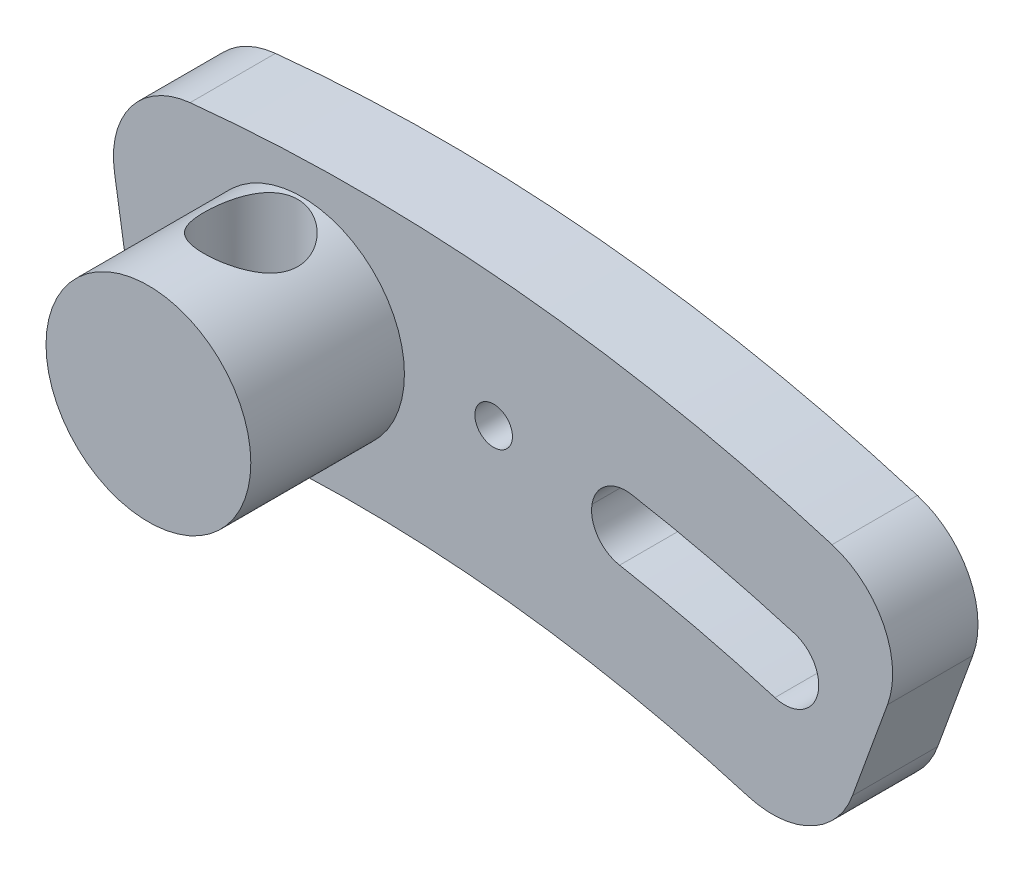
ISO-10303-21;
HEADER;
FILE_DESCRIPTION(('STEP AP214'),'2;1');
FILE_NAME('part.step','',(''),(''),'','','');
FILE_SCHEMA(('AUTOMOTIVE_DESIGN { 1 0 10303 214 1 1 1 1 }'));
ENDSEC;
DATA;
#1=APPLICATION_CONTEXT('core data for automotive mechanical design processes');
#2=APPLICATION_PROTOCOL_DEFINITION('international standard','automotive_design',2000,#1);
#3=PRODUCT_CONTEXT('',#1,'mechanical');
#4=PRODUCT('Part','Part','',(#3));
#5=PRODUCT_RELATED_PRODUCT_CATEGORY('part','',(#4));
#6=PRODUCT_DEFINITION_FORMATION('','',#4);
#7=PRODUCT_DEFINITION_CONTEXT('part definition',#1,'design');
#8=PRODUCT_DEFINITION('design','',#6,#7);
#9=PRODUCT_DEFINITION_SHAPE('','',#8);
#10=(LENGTH_UNIT() NAMED_UNIT(*) SI_UNIT(.MILLI.,.METRE.));
#11=(NAMED_UNIT(*) PLANE_ANGLE_UNIT() SI_UNIT($,.RADIAN.));
#12=(NAMED_UNIT(*) SI_UNIT($,.STERADIAN.) SOLID_ANGLE_UNIT());
#13=UNCERTAINTY_MEASURE_WITH_UNIT(LENGTH_MEASURE(1.E-05),#10,'distance_accuracy_value','');
#14=(GEOMETRIC_REPRESENTATION_CONTEXT(3) GLOBAL_UNCERTAINTY_ASSIGNED_CONTEXT((#13)) GLOBAL_UNIT_ASSIGNED_CONTEXT((#10,
#11,#12)) REPRESENTATION_CONTEXT('',''));
#15=CARTESIAN_POINT('',(0.,0.,0.));
#16=DIRECTION('',(0.,0.,1.));
#17=DIRECTION('',(1.,0.,0.));
#18=AXIS2_PLACEMENT_3D('',#15,#16,#17);
#19=CARTESIAN_POINT('',(-3.22698514229599,110.,8.));
#20=DIRECTION('',(0.,-1.,0.));
#21=DIRECTION('',(0.,0.,-1.));
#22=AXIS2_PLACEMENT_3D('',#19,#20,#21);
#23=CYLINDRICAL_SURFACE('',#22,1.35);
#24=CARTESIAN_POINT('',(-3.22698514229599,82.0000000000025,6.65));
#25=CARTESIAN_POINT('',(-3.15216515419201,82.0000013698354,6.65000247753135));
#26=CARTESIAN_POINT('',(-3.07731568816921,82.0014136771554,6.65624102277392));
#27=CARTESIAN_POINT('',(-2.92974649244813,82.0069111620146,6.68100229374957));
#28=CARTESIAN_POINT('',(-2.85702826026457,82.0109981740235,6.69953345059751));
#29=CARTESIAN_POINT('',(-2.71587521870328,82.0213904818358,6.74826724455556));
#30=CARTESIAN_POINT('',(-2.64743589699006,82.0276933927447,6.77845733698676));
#31=CARTESIAN_POINT('',(-2.51659568333141,82.0418389659953,6.84961135305027));
#32=CARTESIAN_POINT('',(-2.45419470548929,82.0496816064292,6.89057512339396));
#33=CARTESIAN_POINT('',(-2.33614469192069,82.0661973397212,6.98284698392523));
#34=CARTESIAN_POINT('',(-2.28061245239628,82.0748812263394,7.03430257994263));
#35=CARTESIAN_POINT('',(-2.17888947109709,82.0920255195772,7.14578095035087));
#36=CARTESIAN_POINT('',(-2.132699601495,82.1004859052676,7.20580452372825));
#37=CARTESIAN_POINT('',(-2.05045076432634,82.1163321271669,7.33358681718554));
#38=CARTESIAN_POINT('',(-2.01451733656417,82.1237041552096,7.40142820849179));
#39=CARTESIAN_POINT('',(-1.95460705658102,82.1363835408922,7.54238009666721));
#40=CARTESIAN_POINT('',(-1.93062868494147,82.1416911608876,7.61548992259629));
#41=CARTESIAN_POINT('',(-1.89569756190013,82.1495306452571,7.76363295336492));
#42=CARTESIAN_POINT('',(-1.88453738814979,82.1521066579258,7.83861486237324));
#43=CARTESIAN_POINT('',(-1.87491427671407,82.1543237659572,7.98942756050175));
#44=CARTESIAN_POINT('',(-1.87644968396472,82.1539652438817,8.06525823768483));
#45=CARTESIAN_POINT('',(-1.89200750236862,82.1503937067156,8.21406500503628));
#46=CARTESIAN_POINT('',(-1.90578779929494,82.1472360410561,8.28706793928545));
#47=CARTESIAN_POINT('',(-1.94506014014823,82.1385096477921,8.42969844964924));
#48=CARTESIAN_POINT('',(-1.97055287531569,82.132940777885,8.49932582627824));
#49=CARTESIAN_POINT('',(-2.03274567028301,82.1199656237267,8.63390337464242));
#50=CARTESIAN_POINT('',(-2.06953782116897,82.1125443388514,8.69880948142007));
#51=CARTESIAN_POINT('',(-2.15322037223512,82.09670960312,8.82161565801113));
#52=CARTESIAN_POINT('',(-2.20011222446204,82.0882960096772,8.87951471854126));
#53=CARTESIAN_POINT('',(-2.30393949360983,82.0711880083479,8.98805601357564));
#54=CARTESIAN_POINT('',(-2.36108050308293,82.0624915844434,9.03850147109772));
#55=CARTESIAN_POINT('',(-2.48311100409873,82.0459730946328,9.12912679218945));
#56=CARTESIAN_POINT('',(-2.54800065226727,82.0381510464068,9.16930644820143));
#57=CARTESIAN_POINT('',(-2.68393433067385,82.0242348821298,9.23831265538722));
#58=CARTESIAN_POINT('',(-2.75499249299013,82.018144878254,9.26711225034282));
#59=CARTESIAN_POINT('',(-2.90110743925371,82.0084093811165,9.31230685121784));
#60=CARTESIAN_POINT('',(-2.97616360518866,82.0047635112169,9.32870376842401));
#61=CARTESIAN_POINT('',(-3.12645715911486,82.0003810898079,9.34833864205022));
#62=CARTESIAN_POINT('',(-3.20165776800034,81.9995851549816,9.35184523261515));
#63=CARTESIAN_POINT('',(-3.3515703500135,82.0008253569353,9.34632968436369));
#64=CARTESIAN_POINT('',(-3.42628235792943,82.0028612898321,9.33730844750058));
#65=CARTESIAN_POINT('',(-3.5721985872444,82.0094988770844,9.3072158714927));
#66=CARTESIAN_POINT('',(-3.64343358774635,82.0140702852541,9.28628651205227));
#67=CARTESIAN_POINT('',(-3.78138124275661,82.025266653308,9.23313025932815));
#68=CARTESIAN_POINT('',(-3.84809349629254,82.0318917949802,9.20090236591138));
#69=CARTESIAN_POINT('',(-3.97620481302782,82.0466065311743,9.12551168377085));
#70=CARTESIAN_POINT('',(-4.03750942831168,82.054716556785,9.08219247763752));
#71=CARTESIAN_POINT('',(-4.15207545315109,82.0714617343503,8.98605363236334));
#72=CARTESIAN_POINT('',(-4.20533575111509,82.0800969586478,8.93323268244424));
#73=CARTESIAN_POINT('',(-4.30337209607232,82.0971260960653,8.81835392658629));
#74=CARTESIAN_POINT('',(-4.34796161377517,82.1055119743789,8.75613552082997));
#75=CARTESIAN_POINT('',(-4.42606059420626,82.1209006761165,8.624936190872));
#76=CARTESIAN_POINT('',(-4.45957054439423,82.1279035603816,8.55595556435607));
#77=CARTESIAN_POINT('',(-4.51432673962381,82.1396641307652,8.41356396967146));
#78=CARTESIAN_POINT('',(-4.53564327010135,82.1444346550664,8.34018114278913));
#79=CARTESIAN_POINT('',(-4.56561029287473,82.1512118273877,8.19075317022286));
#80=CARTESIAN_POINT('',(-4.5742629472782,82.1532189472013,8.11470848127005));
#81=CARTESIAN_POINT('',(-4.57856045593928,82.1542111085369,7.96399921464997));
#82=CARTESIAN_POINT('',(-4.5745014669067,82.1532649572794,7.88934338434639));
#83=CARTESIAN_POINT('',(-4.55415598571815,82.148613459772,7.74180901410362));
#84=CARTESIAN_POINT('',(-4.53786965539031,82.1449081500395,7.66893045065559));
#85=CARTESIAN_POINT('',(-4.49367860450997,82.1351903218978,7.52727115739337));
#86=CARTESIAN_POINT('',(-4.46581936898315,82.1291868431602,7.45847557687393));
#87=CARTESIAN_POINT('',(-4.39931154817832,82.1155460646543,7.32649174690115));
#88=CARTESIAN_POINT('',(-4.36066176434219,82.1079085834115,7.26330412137847));
#89=CARTESIAN_POINT('',(-4.27269799207498,82.0916565862073,7.14287531009798));
#90=CARTESIAN_POINT('',(-4.22317397629759,82.0830246944887,7.08578984866567));
#91=CARTESIAN_POINT('',(-4.11529014965456,82.0658705908003,6.98064273275772));
#92=CARTESIAN_POINT('',(-4.05692829159386,82.0573484047402,6.93258317483287));
#93=CARTESIAN_POINT('',(-3.93204705531155,82.0412331885354,6.84620981863247));
#94=CARTESIAN_POINT('',(-3.86542553874523,82.0336547246744,6.80804081424488));
#95=CARTESIAN_POINT('',(-3.72655413288279,82.0204282043524,6.74350362194474));
#96=CARTESIAN_POINT('',(-3.65430889266233,82.0147785737257,6.71712580550425));
#97=CARTESIAN_POINT('',(-3.52285303076775,82.007021967466,6.681473693758));
#98=CARTESIAN_POINT('',(-3.4643389550359,82.0044053689446,6.66969412505644));
#99=CARTESIAN_POINT('',(-3.34621783789089,82.0008938818889,6.65395648405438));
#100=CARTESIAN_POINT('',(-3.28661085058498,81.9999989083523,6.6499980256003));
#101=CARTESIAN_POINT('',(-3.22698514229599,82.0000000000025,6.65));
#102=B_SPLINE_CURVE_WITH_KNOTS('',3,(#24,#25,#26,#27,#28,#29,#30,#31,#32,#33,#34,#35,#36,#37,
#38,#39,#40,#41,#42,#43,#44,#45,#46,#47,#48,#49,#50,#51,#52,#53,#54,#55,#56,#57,#58,#59,#60,#61,
#62,#63,#64,#65,#66,#67,#68,#69,#70,#71,#72,#73,#74,#75,#76,#77,#78,#79,#80,#81,#82,#83,#84,#85,
#86,#87,#88,#89,#90,#91,#92,#93,#94,#95,#96,#97,#98,#99,#100,#101),.UNSPECIFIED.,.T.,.F.,(4,2,2,
2,2,2,2,2,2,2,2,2,2,2,2,2,2,2,2,2,2,2,2,2,2,2,2,2,2,2,2,2,2,2,2,2,2,2,4),(0.,0.224241663740819,
0.448637287013031,0.672792136748893,0.896943797366677,1.12449607129391,1.35206957895198,
1.5823196036081,1.81254035735196,2.03898076166387,2.26539164645675,2.48742299990316,
2.70946745880015,2.93337190705681,3.15730856785019,3.38637863923443,3.61545334167317,
3.8450674519034,4.07464617075496,4.29941244386866,4.52416253555177,4.74628747630748,
4.96843208427119,5.19390095656486,5.41940095647714,5.64931600989897,5.87922094656737,
6.10778695095666,6.33631392764451,6.55955660818626,6.78279633417657,7.00516683954807,
7.22756205451491,7.45470451959953,7.68189968060655,7.91225372035929,8.14241931088615,
8.32113129099594,8.49983444729511),.UNSPECIFIED.);
#103=CARTESIAN_POINT('',(-3.22698514229599,82.0000000000025,6.65));
#104=VERTEX_POINT('',#103);
#105=EDGE_CURVE('E189',#104,#104,#102,.T.);
#106=ORIENTED_EDGE('',*,*,#105,.T.);
#107=EDGE_LOOP('',(#106));
#108=FACE_BOUND('',#107,.T.);
#109=CARTESIAN_POINT('',(-3.22698514229599,89.,8.));
#110=DIRECTION('',(0.,1.,0.));
#111=DIRECTION('',(0.,0.,1.));
#112=AXIS2_PLACEMENT_3D('',#109,#110,#111);
#113=CIRCLE('',#112,1.35);
#114=CARTESIAN_POINT('',(-3.22698514229599,89.,9.35));
#115=VERTEX_POINT('',#114);
#116=EDGE_CURVE('E330',#115,#115,#113,.T.);
#117=ORIENTED_EDGE('',*,*,#116,.T.);
#118=EDGE_LOOP('',(#117));
#119=FACE_BOUND('',#118,.T.);
#120=ADVANCED_FACE('F37',(#108,#119),#23,.F.);
#121=CARTESIAN_POINT('',(-3.22698514229599,88.0000000000025,14.));
#122=DIRECTION('',(0.,0.,-1.));
#123=DIRECTION('',(-1.,0.,0.));
#124=AXIS2_PLACEMENT_3D('',#121,#122,#123);
#125=CYLINDRICAL_SURFACE('',#124,6.);
#126=CARTESIAN_POINT('',(-3.22698514229599,94.0000000000025,10.75));
#127=CARTESIAN_POINT('',(-3.37295936939607,93.9999928562482,10.7499912961116));
#128=CARTESIAN_POINT('',(-3.51915375663758,93.9946134496959,10.7383079687476));
#129=CARTESIAN_POINT('',(-3.80730702216887,93.9736262190797,10.6920475155607));
#130=CARTESIAN_POINT('',(-3.94925543192644,93.9579949948272,10.6574180122934));
#131=CARTESIAN_POINT('',(-4.22429820616276,93.9181589845915,10.5668554693923));
#132=CARTESIAN_POINT('',(-4.35742285269068,93.8939855402721,10.5110002518078));
#133=CARTESIAN_POINT('',(-4.61225463514744,93.839352316411,10.3799318945222));
#134=CARTESIAN_POINT('',(-4.73396393712135,93.8088937329897,10.3047224374408));
#135=CARTESIAN_POINT('',(-4.96981081902131,93.7426780876388,10.1324870751645));
#136=CARTESIAN_POINT('',(-5.08320017103433,93.7067252570129,10.0345127594333));
#137=CARTESIAN_POINT('',(-5.29260574945864,93.6343154922205,9.82154808916551));
#138=CARTESIAN_POINT('',(-5.38861095543524,93.5978582539431,9.7065470241305));
#139=CARTESIAN_POINT('',(-5.56648277616626,93.525986521324,9.45414488675144));
#140=CARTESIAN_POINT('',(-5.64709476176153,93.4907787416322,9.3157942846685));
#141=CARTESIAN_POINT('',(-5.78357343575461,93.4285837777513,9.02567489747785));
#142=CARTESIAN_POINT('',(-5.83945541870869,93.4015915158148,8.87391447570491));
#143=CARTESIAN_POINT('',(-5.92164278736903,93.3610474196242,8.56985590711006));
#144=CARTESIAN_POINT('',(-5.94939811895256,93.3468414657001,8.41804075074413));
#145=CARTESIAN_POINT('',(-5.97904041200609,93.3316508142724,8.1112960767505));
#146=CARTESIAN_POINT('',(-5.98094639967167,93.3306563925409,7.95636893380306));
#147=CARTESIAN_POINT('',(-5.95991232689351,93.3414598694865,7.66380372474831));
#148=CARTESIAN_POINT('',(-5.93935113410802,93.3520330981811,7.52593945417305));
#149=CARTESIAN_POINT('',(-5.878019678262,93.382673920298,7.25589192779982));
#150=CARTESIAN_POINT('',(-5.83724448010985,93.402743832207,7.12371006788639));
#151=CARTESIAN_POINT('',(-5.7358381832111,93.4505823415567,6.8651462484286));
#152=CARTESIAN_POINT('',(-5.67477433913036,93.4785164985029,6.73896604740834));
#153=CARTESIAN_POINT('',(-5.53483908039193,93.5389177929273,6.49809016222056));
#154=CARTESIAN_POINT('',(-5.45595997902998,93.571386884768,6.3833994663275));
#155=CARTESIAN_POINT('',(-5.27300640080886,93.6413067685695,6.15616469475695));
#156=CARTESIAN_POINT('',(-5.16716212858854,93.6789239365036,6.0450921827368));
#157=CARTESIAN_POINT('',(-4.93806800197375,93.7520997070342,5.8417215169422));
#158=CARTESIAN_POINT('',(-4.81481223417682,93.7876576044393,5.74942976770679));
#159=CARTESIAN_POINT('',(-4.54911537250856,93.8541707103663,5.58343263855906));
#160=CARTESIAN_POINT('',(-4.40617277264103,93.8849336562068,5.51044697672934));
#161=CARTESIAN_POINT('',(-4.10826606516258,93.9368457966323,5.39009526794965));
#162=CARTESIAN_POINT('',(-3.95331009909124,93.9580014366185,5.34271204063727));
#163=CARTESIAN_POINT('',(-3.64796189486707,93.9870323769491,5.27826959614872));
#164=CARTESIAN_POINT('',(-3.49806684926073,93.9957669837716,5.25924330594139));
#165=CARTESIAN_POINT('',(-3.19697897821071,94.0018112137429,5.24604263430623));
#166=CARTESIAN_POINT('',(-3.04578665250113,93.9991250551167,5.25185907729407));
#167=CARTESIAN_POINT('',(-2.75641772117654,93.9831653624132,5.28688768476484));
#168=CARTESIAN_POINT('',(-2.61801908373753,93.9705656149142,5.31461140069393));
#169=CARTESIAN_POINT('',(-2.348050151477,93.9368333652005,5.39047118075276));
#170=CARTESIAN_POINT('',(-2.21648066973204,93.9156998495766,5.43860966922889));
#171=CARTESIAN_POINT('',(-1.95926540973754,93.8660534675259,5.55542254185256));
#172=CARTESIAN_POINT('',(-1.83392865127741,93.8373326049491,5.62468596361295));
#173=CARTESIAN_POINT('',(-1.59620852875991,93.7754376665017,5.78114018538738));
#174=CARTESIAN_POINT('',(-1.48383088681831,93.7422616373347,5.86833885779146));
#175=CARTESIAN_POINT('',(-1.26511827281006,93.6714540830691,6.06681633281228));
#176=CARTESIAN_POINT('',(-1.1601119922472,93.6336836857722,6.17951308846481));
#177=CARTESIAN_POINT('',(-0.970016849382061,93.5602608927402,6.42131124902468));
#178=CARTESIAN_POINT('',(-0.884936536780864,93.5246094110532,6.55041965921392));
#179=CARTESIAN_POINT('',(-0.734938506205101,93.45862917984,6.82631097903455));
#180=CARTESIAN_POINT('',(-0.670674837720742,93.428484119292,6.97349696735836));
#181=CARTESIAN_POINT('',(-0.568483033420382,93.3791859057316,7.27843792575284));
#182=CARTESIAN_POINT('',(-0.530527021404543,93.3600211215113,7.43618151372615));
#183=CARTESIAN_POINT('',(-0.485050939727797,93.336889394274,7.74278746958436));
#184=CARTESIAN_POINT('',(-0.475140849683783,93.3317306713983,7.89120536594577));
#185=CARTESIAN_POINT('',(-0.479393787911431,93.3339248434412,8.18758278469796));
#186=CARTESIAN_POINT('',(-0.493550726593898,93.3412745733937,8.33554241355288));
#187=CARTESIAN_POINT('',(-0.543404548968759,93.3664776616982,8.61632126096154));
#188=CARTESIAN_POINT('',(-0.577573039625181,93.3835836631662,8.7494862402212));
#189=CARTESIAN_POINT('',(-0.664802576417267,93.425638372041,9.00814882370283));
#190=CARTESIAN_POINT('',(-0.717869180095042,93.4505893862498,9.1336441597092));
#191=CARTESIAN_POINT('',(-0.845352311652035,93.507539719389,9.38243524911008));
#192=CARTESIAN_POINT('',(-0.920940335086082,93.5398938516059,9.50504755913087));
#193=CARTESIAN_POINT('',(-1.08985401779029,93.6072218129047,9.73658592693095));
#194=CARTESIAN_POINT('',(-1.18318764937333,93.6421968151317,9.84550579663011));
#195=CARTESIAN_POINT('',(-1.39546136013583,93.7148267302437,10.0573223883782));
#196=CARTESIAN_POINT('',(-1.51599488855498,93.7524189738214,10.1586530727955));
#197=CARTESIAN_POINT('',(-1.77357876165201,93.8228388623383,10.3398571204278));
#198=CARTESIAN_POINT('',(-1.91063676977975,93.8556642809211,10.4197204720015));
#199=CARTESIAN_POINT('',(-2.19695931936145,93.9127056580292,10.5546670130551));
#200=CARTESIAN_POINT('',(-2.34612060496377,93.936986607398,10.6099381469024));
#201=CARTESIAN_POINT('',(-2.575924814633,93.9650750646171,10.6730038839497));
#202=CARTESIAN_POINT('',(-2.6534728029854,93.9730460330809,10.6907127773571));
#203=CARTESIAN_POINT('',(-2.81003668065093,93.9860085881368,10.7193692389908));
#204=CARTESIAN_POINT('',(-2.88905154260735,93.9910021844275,10.7303213681441));
#205=CARTESIAN_POINT('',(-3.01137944617834,93.9962793230083,10.7418747332151));
#206=CARTESIAN_POINT('',(-3.05443060258507,93.9976727313552,10.7449196404165));
#207=CARTESIAN_POINT('',(-3.1406431305977,93.9995341342452,10.7489835782237));
#208=CARTESIAN_POINT('',(-3.18380450404825,94.0000021131966,10.7500025746974));
#209=CARTESIAN_POINT('',(-3.22698514229599,94.0000000000025,10.75));
#210=B_SPLINE_CURVE_WITH_KNOTS('',3,(#126,#127,#128,#129,#130,#131,#132,#133,#134,#135,#136,
#137,#138,#139,#140,#141,#142,#143,#144,#145,#146,#147,#148,#149,#150,#151,#152,#153,#154,#155,
#156,#157,#158,#159,#160,#161,#162,#163,#164,#165,#166,#167,#168,#169,#170,#171,#172,#173,#174,
#175,#176,#177,#178,#179,#180,#181,#182,#183,#184,#185,#186,#187,#188,#189,#190,#191,#192,#193,
#194,#195,#196,#197,#198,#199,#200,#201,#202,#203,#204,#205,#206,#207,#208,#209),.UNSPECIFIED.,
.T.,.F.,(4,2,2,2,2,2,2,2,2,2,2,2,2,2,2,2,2,2,2,2,2,2,2,2,2,2,2,2,2,2,2,2,2,2,2,2,2,2,2,2,2,4),
(0.,0.437754141052368,0.876510967438006,1.3136744164469,1.75075474579367,2.21110788659584,
2.67175184782025,3.16111458884534,3.65017425340656,4.11249673696635,4.57447891340611,
4.99189919161597,5.40942142995392,5.83649165508694,6.26374650035259,6.73556418298497,
7.20754249431486,7.69520810913115,8.1825460711175,8.63418492344596,9.0856569788316,
9.50884661306336,9.9320865170536,10.3684151766246,10.8049357659305,11.2786150141176,
11.7524971345903,12.2400799384891,12.7271452952703,13.1712342695151,13.615210894331,
14.0290308817074,14.4429726655693,14.8840490448588,15.3253240503887,15.808698867475,
16.2922987247196,16.7721364070952,17.0116762116357,17.251054145437,17.3805440226725,
17.5100360815225),.UNSPECIFIED.);
#211=CARTESIAN_POINT('',(-3.22698514229599,94.0000000000025,10.75));
#212=VERTEX_POINT('',#211);
#213=EDGE_CURVE('E41',#212,#212,#210,.T.);
#214=ORIENTED_EDGE('',*,*,#213,.T.);
#215=EDGE_LOOP('',(#214));
#216=FACE_BOUND('',#215,.T.);
#217=CARTESIAN_POINT('',(-3.22698514229599,88.0000000000025,5.));
#218=DIRECTION('',(0.,0.,1.));
#219=DIRECTION('',(1.,0.,0.));
#220=AXIS2_PLACEMENT_3D('',#217,#218,#219);
#221=CIRCLE('',#220,6.);
#222=CARTESIAN_POINT('',(2.77301485770401,88.0000000000025,5.));
#223=VERTEX_POINT('',#222);
#224=EDGE_CURVE('E188',#223,#223,#221,.F.);
#225=ORIENTED_EDGE('',*,*,#224,.F.);
#226=EDGE_LOOP('',(#225));
#227=FACE_BOUND('',#226,.T.);
#228=CARTESIAN_POINT('',(-3.22698514229599,88.0000000000025,14.));
#229=DIRECTION('',(0.,0.,1.));
#230=DIRECTION('',(1.,0.,0.));
#231=AXIS2_PLACEMENT_3D('',#228,#229,#230);
#232=CIRCLE('',#231,6.);
#233=CARTESIAN_POINT('',(2.77301485770401,88.0000000000025,14.));
#234=VERTEX_POINT('',#233);
#235=EDGE_CURVE('E195',#234,#234,#232,.T.);
#236=ORIENTED_EDGE('',*,*,#235,.F.);
#237=EDGE_LOOP('',(#236));
#238=FACE_BOUND('',#237,.T.);
#239=ORIENTED_EDGE('',*,*,#105,.F.);
#240=EDGE_LOOP('',(#239));
#241=FACE_BOUND('',#240,.T.);
#242=ADVANCED_FACE('F197',(#216,#227,#238,#241),#125,.T.);
#243=CARTESIAN_POINT('',(-1.40859546249317E-12,2.51187959321442E-12,5.));
#244=DIRECTION('',(0.,0.,1.));
#245=DIRECTION('',(1.,0.,0.));
#246=AXIS2_PLACEMENT_3D('',#243,#244,#245);
#247=PLANE('',#246);
#248=ORIENTED_EDGE('',*,*,#224,.T.);
#249=EDGE_LOOP('',(#248));
#250=FACE_BOUND('',#249,.T.);
#251=CARTESIAN_POINT('',(-1.40859546249317E-12,2.51187959321442E-12,5.));
#252=DIRECTION('',(0.,0.,1.));
#253=DIRECTION('',(1.,0.,0.));
#254=AXIS2_PLACEMENT_3D('',#251,#252,#253);
#255=CIRCLE('',#254,80.);
#256=CARTESIAN_POINT('',(22.8921490953657,76.6547422524913,5.));
#257=VERTEX_POINT('',#256);
#258=CARTESIAN_POINT('',(-7.84514147950522,79.6144067061168,5.));
#259=VERTEX_POINT('',#258);
#260=EDGE_CURVE('E158',#257,#259,#255,.T.);
#261=ORIENTED_EDGE('',*,*,#260,.F.);
#262=CARTESIAN_POINT('',(24.3229084138261,81.4456636432718,5.));
#263=DIRECTION('',(0.,0.,1.));
#264=DIRECTION('',(1.,0.,0.));
#265=AXIS2_PLACEMENT_3D('',#262,#263,#264);
#266=CIRCLE('',#265,5.);
#267=CARTESIAN_POINT('',(29.0213715177557,79.7355629266435,5.));
#268=VERTEX_POINT('',#267);
#269=EDGE_CURVE('E317',#257,#268,#266,.T.);
#270=ORIENTED_EDGE('',*,*,#269,.T.);
#271=DIRECTION('',(0.342020143325669,0.939692620785908,0.));
#272=VECTOR('',#271,1.);
#273=CARTESIAN_POINT('',(27.3616114660521,75.1754096628752,5.));
#274=LINE('',#273,#272);
#275=CARTESIAN_POINT('',(31.0768167418218,85.3828522666909,5.));
#276=VERTEX_POINT('',#275);
#277=EDGE_CURVE('E240',#268,#276,#274,.T.);
#278=ORIENTED_EDGE('',*,*,#277,.T.);
#279=CARTESIAN_POINT('',(26.3783536378922,87.0929529833193,5.));
#280=DIRECTION('',(0.,0.,1.));
#281=DIRECTION('',(1.,0.,0.));
#282=AXIS2_PLACEMENT_3D('',#279,#280,#281);
#283=CIRCLE('',#282,5.);
#284=CARTESIAN_POINT('',(27.8277137278864,91.8782800703147,5.));
#285=VERTEX_POINT('',#284);
#286=EDGE_CURVE('E315',#276,#285,#283,.T.);
#287=ORIENTED_EDGE('',*,*,#286,.T.);
#288=CARTESIAN_POINT('',(-1.40859546249317E-12,2.51187959321442E-12,5.));
#289=DIRECTION('',(0.,0.,1.));
#290=DIRECTION('',(1.,0.,0.));
#291=AXIS2_PLACEMENT_3D('',#288,#289,#290);
#292=CIRCLE('',#291,96.);
#293=CARTESIAN_POINT('',(-9.78523793135469,95.4999953854831,5.));
#294=VERTEX_POINT('',#293);
#295=EDGE_CURVE('E243',#285,#294,#292,.T.);
#296=ORIENTED_EDGE('',*,*,#295,.T.);
#297=CARTESIAN_POINT('',(-9.27559012243004,90.5260372924893,5.));
#298=DIRECTION('',(0.,0.,1.));
#299=DIRECTION('',(1.,0.,0.));
#300=AXIS2_PLACEMENT_3D('',#297,#298,#299);
#301=CIRCLE('',#300,5.);
#302=CARTESIAN_POINT('',(-14.2140318254057,89.7438649672881,5.));
#303=VERTEX_POINT('',#302);
#304=EDGE_CURVE('E64',#294,#303,#301,.T.);
#305=ORIENTED_EDGE('',*,*,#304,.T.);
#306=DIRECTION('',(0.156434465040231,-0.987688340595138,0.));
#307=VECTOR('',#306,1.);
#308=CARTESIAN_POINT('',(-15.0177086438636,94.8180806971357,5.));
#309=LINE('',#308,#307);
#310=CARTESIAN_POINT('',(-13.2739045249499,83.8081348000478,5.));
#311=VERTEX_POINT('',#310);
#312=EDGE_CURVE('E246',#303,#311,#309,.T.);
#313=ORIENTED_EDGE('',*,*,#312,.T.);
#314=CARTESIAN_POINT('',(-8.3354628219742,84.5903071252489,5.));
#315=DIRECTION('',(0.,0.,1.));
#316=DIRECTION('',(1.,0.,0.));
#317=AXIS2_PLACEMENT_3D('',#314,#315,#316);
#318=CIRCLE('',#317,5.);
#319=EDGE_CURVE('E311',#311,#259,#318,.T.);
#320=ORIENTED_EDGE('',*,*,#319,.T.);
#321=EDGE_LOOP('',(#261,#270,#278,#287,#296,#305,#313,#320));
#322=FACE_BOUND('',#321,.T.);
#323=CARTESIAN_POINT('',(7.99999999999859,88.0000000000025,5.));
#324=DIRECTION('',(0.,0.,1.));
#325=DIRECTION('',(1.,0.,0.));
#326=AXIS2_PLACEMENT_3D('',#323,#324,#325);
#327=CIRCLE('',#326,1.10000000000062);
#328=CARTESIAN_POINT('',(9.09999999999921,88.0000000000025,5.));
#329=VERTEX_POINT('',#328);
#330=EDGE_CURVE('E168',#329,#329,#327,.F.);
#331=ORIENTED_EDGE('',*,*,#330,.T.);
#332=EDGE_LOOP('',(#331));
#333=FACE_BOUND('',#332,.T.);
#334=CARTESIAN_POINT('',(-1.40859546249317E-12,2.51187959321442E-12,5.));
#335=DIRECTION('',(0.,0.,1.));
#336=DIRECTION('',(1.,0.,0.));
#337=AXIS2_PLACEMENT_3D('',#334,#335,#336);
#338=CIRCLE('',#337,90.);
#339=CARTESIAN_POINT('',(16.0957368580438,88.5490104687625,5.));
#340=VERTEX_POINT('',#339);
#341=CARTESIAN_POINT('',(25.6174844033101,86.2771377182074,5.));
#342=VERTEX_POINT('',#341);
#343=EDGE_CURVE('E167',#340,#342,#338,.F.);
#344=ORIENTED_EDGE('',*,*,#343,.T.);
#345=CARTESIAN_POINT('',(25.0482069721254,84.3598679911362,5.));
#346=DIRECTION('',(0.,0.,1.));
#347=DIRECTION('',(1.,0.,0.));
#348=AXIS2_PLACEMENT_3D('',#345,#346,#347);
#349=CIRCLE('',#348,2.);
#350=CARTESIAN_POINT('',(26.9520433491665,83.7471632910931,5.));
#351=VERTEX_POINT('',#350);
#352=EDGE_CURVE('E270',#342,#351,#349,.F.);
#353=ORIENTED_EDGE('',*,*,#352,.T.);
#354=CARTESIAN_POINT('',(25.0482069721254,84.3598679911362,5.));
#355=DIRECTION('',(0.,0.,1.));
#356=DIRECTION('',(1.,0.,0.));
#357=AXIS2_PLACEMENT_3D('',#354,#355,#356);
#358=CIRCLE('',#357,2.);
#359=CARTESIAN_POINT('',(24.4789295409407,82.442598264065,5.));
#360=VERTEX_POINT('',#359);
#361=EDGE_CURVE('E166',#351,#360,#358,.F.);
#362=ORIENTED_EDGE('',*,*,#361,.T.);
#363=CARTESIAN_POINT('',(-1.40859546249317E-12,2.51187959321442E-12,5.));
#364=DIRECTION('',(0.,0.,1.));
#365=DIRECTION('',(1.,0.,0.));
#366=AXIS2_PLACEMENT_3D('',#363,#364,#365);
#367=CIRCLE('',#366,86.);
#368=CARTESIAN_POINT('',(15.380370775464,84.6134988923732,5.));
#369=VERTEX_POINT('',#368);
#370=EDGE_CURVE('E150',#369,#360,#367,.F.);
#371=ORIENTED_EDGE('',*,*,#370,.F.);
#372=CARTESIAN_POINT('',(15.7380538167539,86.5812546805678,5.));
#373=DIRECTION('',(0.,0.,1.));
#374=DIRECTION('',(1.,0.,0.));
#375=AXIS2_PLACEMENT_3D('',#372,#373,#374);
#376=CIRCLE('',#375,2.);
#377=CARTESIAN_POINT('',(13.7626771355636,86.8941236106483,5.));
#378=VERTEX_POINT('',#377);
#379=EDGE_CURVE('E163',#369,#378,#376,.F.);
#380=ORIENTED_EDGE('',*,*,#379,.T.);
#381=CARTESIAN_POINT('',(15.7380538167539,86.5812546805679,5.));
#382=DIRECTION('',(0.,0.,1.));
#383=DIRECTION('',(1.,0.,0.));
#384=AXIS2_PLACEMENT_3D('',#381,#382,#383);
#385=CIRCLE('',#384,2.);
#386=EDGE_CURVE('E179',#378,#340,#385,.F.);
#387=ORIENTED_EDGE('',*,*,#386,.T.);
#388=EDGE_LOOP('',(#344,#353,#362,#371,#380,#387));
#389=FACE_BOUND('',#388,.T.);
#390=ADVANCED_FACE('F162',(#250,#322,#333,#389),#247,.T.);
#391=CARTESIAN_POINT('',(-1.40859546249317E-12,2.51187959321442E-12,0.));
#392=DIRECTION('',(0.,0.,1.));
#393=DIRECTION('',(1.,0.,0.));
#394=AXIS2_PLACEMENT_3D('',#391,#392,#393);
#395=PLANE('',#394);
#396=CARTESIAN_POINT('',(7.99999999999859,88.0000000000025,0.));
#397=DIRECTION('',(0.,0.,1.));
#398=DIRECTION('',(1.,0.,0.));
#399=AXIS2_PLACEMENT_3D('',#396,#397,#398);
#400=CIRCLE('',#399,1.10000000000062);
#401=CARTESIAN_POINT('',(9.09999999999921,88.0000000000025,0.));
#402=VERTEX_POINT('',#401);
#403=EDGE_CURVE('E186',#402,#402,#400,.T.);
#404=ORIENTED_EDGE('',*,*,#403,.T.);
#405=EDGE_LOOP('',(#404));
#406=FACE_BOUND('',#405,.T.);
#407=DIRECTION('',(0.342020143325669,0.939692620785908,0.));
#408=VECTOR('',#407,1.);
#409=CARTESIAN_POINT('',(27.3616114660521,75.1754096628752,0.));
#410=LINE('',#409,#408);
#411=CARTESIAN_POINT('',(29.0213715177557,79.7355629266435,0.));
#412=VERTEX_POINT('',#411);
#413=CARTESIAN_POINT('',(31.0768167418218,85.3828522666909,0.));
#414=VERTEX_POINT('',#413);
#415=EDGE_CURVE('E239',#412,#414,#410,.T.);
#416=ORIENTED_EDGE('',*,*,#415,.F.);
#417=CARTESIAN_POINT('',(24.3229084138261,81.4456636432718,0.));
#418=DIRECTION('',(0.,0.,1.));
#419=DIRECTION('',(1.,0.,0.));
#420=AXIS2_PLACEMENT_3D('',#417,#418,#419);
#421=CIRCLE('',#420,5.);
#422=CARTESIAN_POINT('',(22.8921490953657,76.6547422524913,0.));
#423=VERTEX_POINT('',#422);
#424=EDGE_CURVE('E367',#412,#423,#421,.F.);
#425=ORIENTED_EDGE('',*,*,#424,.T.);
#426=CARTESIAN_POINT('',(-1.40859546249317E-12,2.51187959321442E-12,0.));
#427=DIRECTION('',(0.,0.,1.));
#428=DIRECTION('',(1.,0.,0.));
#429=AXIS2_PLACEMENT_3D('',#426,#427,#428);
#430=CIRCLE('',#429,80.);
#431=CARTESIAN_POINT('',(-7.84514147950522,79.6144067061168,0.));
#432=VERTEX_POINT('',#431);
#433=EDGE_CURVE('E244',#423,#432,#430,.T.);
#434=ORIENTED_EDGE('',*,*,#433,.T.);
#435=CARTESIAN_POINT('',(-8.3354628219742,84.5903071252489,0.));
#436=DIRECTION('',(0.,0.,1.));
#437=DIRECTION('',(1.,0.,0.));
#438=AXIS2_PLACEMENT_3D('',#435,#436,#437);
#439=CIRCLE('',#438,5.);
#440=CARTESIAN_POINT('',(-13.2739045249499,83.8081348000478,0.));
#441=VERTEX_POINT('',#440);
#442=EDGE_CURVE('E386',#432,#441,#439,.F.);
#443=ORIENTED_EDGE('',*,*,#442,.T.);
#444=DIRECTION('',(0.156434465040231,-0.987688340595138,0.));
#445=VECTOR('',#444,1.);
#446=CARTESIAN_POINT('',(-15.0177086438636,94.8180806971357,0.));
#447=LINE('',#446,#445);
#448=CARTESIAN_POINT('',(-14.2140318254057,89.7438649672881,0.));
#449=VERTEX_POINT('',#448);
#450=EDGE_CURVE('E255',#449,#441,#447,.T.);
#451=ORIENTED_EDGE('',*,*,#450,.F.);
#452=CARTESIAN_POINT('',(-9.27559012243004,90.5260372924893,0.));
#453=DIRECTION('',(0.,0.,1.));
#454=DIRECTION('',(1.,0.,0.));
#455=AXIS2_PLACEMENT_3D('',#452,#453,#454);
#456=CIRCLE('',#455,5.);
#457=CARTESIAN_POINT('',(-9.78523793135469,95.4999953854831,0.));
#458=VERTEX_POINT('',#457);
#459=EDGE_CURVE('E383',#449,#458,#456,.F.);
#460=ORIENTED_EDGE('',*,*,#459,.T.);
#461=CARTESIAN_POINT('',(-1.40859546249317E-12,2.51187959321442E-12,0.));
#462=DIRECTION('',(0.,0.,1.));
#463=DIRECTION('',(1.,0.,0.));
#464=AXIS2_PLACEMENT_3D('',#461,#462,#463);
#465=CIRCLE('',#464,96.);
#466=CARTESIAN_POINT('',(27.8277137278864,91.8782800703147,0.));
#467=VERTEX_POINT('',#466);
#468=EDGE_CURVE('E252',#467,#458,#465,.T.);
#469=ORIENTED_EDGE('',*,*,#468,.F.);
#470=CARTESIAN_POINT('',(26.3783536378922,87.0929529833193,0.));
#471=DIRECTION('',(0.,0.,1.));
#472=DIRECTION('',(1.,0.,0.));
#473=AXIS2_PLACEMENT_3D('',#470,#471,#472);
#474=CIRCLE('',#473,5.);
#475=EDGE_CURVE('E370',#467,#414,#474,.F.);
#476=ORIENTED_EDGE('',*,*,#475,.T.);
#477=EDGE_LOOP('',(#416,#425,#434,#443,#451,#460,#469,#476));
#478=FACE_BOUND('',#477,.T.);
#479=CARTESIAN_POINT('',(25.0482069721254,84.3598679911362,0.));
#480=DIRECTION('',(0.,0.,1.));
#481=DIRECTION('',(1.,0.,0.));
#482=AXIS2_PLACEMENT_3D('',#479,#480,#481);
#483=CIRCLE('',#482,2.);
#484=CARTESIAN_POINT('',(24.4789295409407,82.442598264065,0.));
#485=VERTEX_POINT('',#484);
#486=CARTESIAN_POINT('',(26.9520433491665,83.7471632910931,0.));
#487=VERTEX_POINT('',#486);
#488=EDGE_CURVE('E265',#485,#487,#483,.T.);
#489=ORIENTED_EDGE('',*,*,#488,.T.);
#490=CARTESIAN_POINT('',(25.0482069721254,84.3598679911362,0.));
#491=DIRECTION('',(0.,0.,1.));
#492=DIRECTION('',(1.,0.,0.));
#493=AXIS2_PLACEMENT_3D('',#490,#491,#492);
#494=CIRCLE('',#493,2.);
#495=CARTESIAN_POINT('',(25.6174844033101,86.2771377182074,0.));
#496=VERTEX_POINT('',#495);
#497=EDGE_CURVE('E268',#487,#496,#494,.T.);
#498=ORIENTED_EDGE('',*,*,#497,.T.);
#499=CARTESIAN_POINT('',(-1.40859546249317E-12,2.51187959321442E-12,0.));
#500=DIRECTION('',(0.,0.,1.));
#501=DIRECTION('',(1.,0.,0.));
#502=AXIS2_PLACEMENT_3D('',#499,#500,#501);
#503=CIRCLE('',#502,90.);
#504=CARTESIAN_POINT('',(16.0957368580438,88.5490104687625,0.));
#505=VERTEX_POINT('',#504);
#506=EDGE_CURVE('E230',#496,#505,#503,.T.);
#507=ORIENTED_EDGE('',*,*,#506,.T.);
#508=CARTESIAN_POINT('',(15.7380538167539,86.5812546805679,0.));
#509=DIRECTION('',(0.,0.,1.));
#510=DIRECTION('',(1.,0.,0.));
#511=AXIS2_PLACEMENT_3D('',#508,#509,#510);
#512=CIRCLE('',#511,2.);
#513=CARTESIAN_POINT('',(13.7626771355636,86.8941236106483,0.));
#514=VERTEX_POINT('',#513);
#515=EDGE_CURVE('E272',#505,#514,#512,.T.);
#516=ORIENTED_EDGE('',*,*,#515,.T.);
#517=CARTESIAN_POINT('',(15.7380538167539,86.5812546805678,0.));
#518=DIRECTION('',(0.,0.,1.));
#519=DIRECTION('',(1.,0.,0.));
#520=AXIS2_PLACEMENT_3D('',#517,#518,#519);
#521=CIRCLE('',#520,2.);
#522=CARTESIAN_POINT('',(15.380370775464,84.6134988923732,0.));
#523=VERTEX_POINT('',#522);
#524=EDGE_CURVE('E175',#514,#523,#521,.T.);
#525=ORIENTED_EDGE('',*,*,#524,.T.);
#526=CARTESIAN_POINT('',(-1.40859546249317E-12,2.51187959321442E-12,0.));
#527=DIRECTION('',(0.,0.,1.));
#528=DIRECTION('',(1.,0.,0.));
#529=AXIS2_PLACEMENT_3D('',#526,#527,#528);
#530=CIRCLE('',#529,86.);
#531=EDGE_CURVE('E153',#485,#523,#530,.T.);
#532=ORIENTED_EDGE('',*,*,#531,.F.);
#533=EDGE_LOOP('',(#489,#498,#507,#516,#525,#532));
#534=FACE_BOUND('',#533,.T.);
#535=ADVANCED_FACE('F281',(#406,#478,#534),#395,.F.);
#536=CARTESIAN_POINT('',(27.3616114660521,75.1754096628752,5.));
#537=DIRECTION('',(-0.939692620785908,0.342020143325669,0.));
#538=DIRECTION('',(-0.342020143325669,-0.939692620785908,0.));
#539=AXIS2_PLACEMENT_3D('',#536,#537,#538);
#540=PLANE('',#539);
#541=ORIENTED_EDGE('',*,*,#277,.F.);
#542=DIRECTION('',(0.,0.,1.));
#543=VECTOR('',#542,1.);
#544=CARTESIAN_POINT('',(29.0213715177557,79.7355629266435,0.));
#545=LINE('',#544,#543);
#546=EDGE_CURVE('E177',#268,#412,#545,.F.);
#547=ORIENTED_EDGE('',*,*,#546,.T.);
#548=ORIENTED_EDGE('',*,*,#415,.T.);
#549=DIRECTION('',(0.,0.,-1.));
#550=VECTOR('',#549,1.);
#551=CARTESIAN_POINT('',(31.0768167418218,85.3828522666909,5.));
#552=LINE('',#551,#550);
#553=EDGE_CURVE('E174',#414,#276,#552,.F.);
#554=ORIENTED_EDGE('',*,*,#553,.T.);
#555=EDGE_LOOP('',(#541,#547,#548,#554));
#556=FACE_BOUND('',#555,.T.);
#557=ADVANCED_FACE('F297',(#556),#540,.F.);
#558=CARTESIAN_POINT('',(-1.40859546249317E-12,2.51187959321442E-12,5.));
#559=DIRECTION('',(0.,0.,-1.));
#560=DIRECTION('',(-1.,0.,0.));
#561=AXIS2_PLACEMENT_3D('',#558,#559,#560);
#562=CYLINDRICAL_SURFACE('',#561,96.);
#563=ORIENTED_EDGE('',*,*,#295,.F.);
#564=DIRECTION('',(0.,0.,-1.));
#565=VECTOR('',#564,1.);
#566=CARTESIAN_POINT('',(27.8277137278864,91.8782800703147,5.));
#567=LINE('',#566,#565);
#568=EDGE_CURVE('E326',#285,#467,#567,.T.);
#569=ORIENTED_EDGE('',*,*,#568,.T.);
#570=ORIENTED_EDGE('',*,*,#468,.T.);
#571=DIRECTION('',(0.,0.,-1.));
#572=VECTOR('',#571,1.);
#573=CARTESIAN_POINT('',(-9.78523793135469,95.4999953854831,5.));
#574=LINE('',#573,#572);
#575=EDGE_CURVE('E324',#458,#294,#574,.F.);
#576=ORIENTED_EDGE('',*,*,#575,.T.);
#577=EDGE_LOOP('',(#563,#569,#570,#576));
#578=FACE_BOUND('',#577,.T.);
#579=ADVANCED_FACE('F380',(#578),#562,.T.);
#580=CARTESIAN_POINT('',(-15.0177086438636,94.8180806971357,5.));
#581=DIRECTION('',(0.987688340595138,0.156434465040231,0.));
#582=DIRECTION('',(-0.156434465040231,0.987688340595138,0.));
#583=AXIS2_PLACEMENT_3D('',#580,#581,#582);
#584=PLANE('',#583);
#585=ORIENTED_EDGE('',*,*,#450,.T.);
#586=DIRECTION('',(0.,0.,1.));
#587=VECTOR('',#586,1.);
#588=CARTESIAN_POINT('',(-13.2739045249499,83.8081348000478,5.));
#589=LINE('',#588,#587);
#590=EDGE_CURVE('E11',#441,#311,#589,.T.);
#591=ORIENTED_EDGE('',*,*,#590,.T.);
#592=ORIENTED_EDGE('',*,*,#312,.F.);
#593=DIRECTION('',(0.,0.,-1.));
#594=VECTOR('',#593,1.);
#595=CARTESIAN_POINT('',(-14.2140318254057,89.7438649672881,5.));
#596=LINE('',#595,#594);
#597=EDGE_CURVE('E51',#303,#449,#596,.T.);
#598=ORIENTED_EDGE('',*,*,#597,.T.);
#599=EDGE_LOOP('',(#585,#591,#592,#598));
#600=FACE_BOUND('',#599,.T.);
#601=ADVANCED_FACE('F385',(#600),#584,.F.);
#602=CARTESIAN_POINT('',(-1.40859546249317E-12,2.51187959321442E-12,5.));
#603=DIRECTION('',(0.,0.,-1.));
#604=DIRECTION('',(-1.,0.,0.));
#605=AXIS2_PLACEMENT_3D('',#602,#603,#604);
#606=CYLINDRICAL_SURFACE('',#605,80.);
#607=ORIENTED_EDGE('',*,*,#433,.F.);
#608=DIRECTION('',(0.,0.,-1.));
#609=VECTOR('',#608,1.);
#610=CARTESIAN_POINT('',(22.8921490953657,76.6547422524913,5.));
#611=LINE('',#610,#609);
#612=EDGE_CURVE('E319',#423,#257,#611,.F.);
#613=ORIENTED_EDGE('',*,*,#612,.T.);
#614=ORIENTED_EDGE('',*,*,#260,.T.);
#615=DIRECTION('',(0.,0.,-1.));
#616=VECTOR('',#615,1.);
#617=CARTESIAN_POINT('',(-7.84514147950522,79.6144067061168,5.));
#618=LINE('',#617,#616);
#619=EDGE_CURVE('E313',#259,#432,#618,.T.);
#620=ORIENTED_EDGE('',*,*,#619,.T.);
#621=EDGE_LOOP('',(#607,#613,#614,#620));
#622=FACE_BOUND('',#621,.T.);
#623=ADVANCED_FACE('F359',(#622),#606,.F.);
#624=CARTESIAN_POINT('',(7.99999999999859,88.0000000000025,10.));
#625=DIRECTION('',(0.,0.,-1.));
#626=DIRECTION('',(-1.,0.,0.));
#627=AXIS2_PLACEMENT_3D('',#624,#625,#626);
#628=CYLINDRICAL_SURFACE('',#627,1.10000000000062);
#629=ORIENTED_EDGE('',*,*,#330,.F.);
#630=EDGE_LOOP('',(#629));
#631=FACE_BOUND('',#630,.T.);
#632=ORIENTED_EDGE('',*,*,#403,.F.);
#633=EDGE_LOOP('',(#632));
#634=FACE_BOUND('',#633,.T.);
#635=ADVANCED_FACE('F356',(#631,#634),#628,.F.);
#636=CARTESIAN_POINT('',(-1.40859546249317E-12,2.51187959321442E-12,10.));
#637=DIRECTION('',(0.,0.,-1.));
#638=DIRECTION('',(-1.,0.,0.));
#639=AXIS2_PLACEMENT_3D('',#636,#637,#638);
#640=CYLINDRICAL_SURFACE('',#639,90.);
#641=ORIENTED_EDGE('',*,*,#506,.F.);
#642=DIRECTION('',(0.,0.,-1.));
#643=VECTOR('',#642,1.);
#644=CARTESIAN_POINT('',(25.6174844033101,86.2771377182074,10.));
#645=LINE('',#644,#643);
#646=EDGE_CURVE('E263',#496,#342,#645,.F.);
#647=ORIENTED_EDGE('',*,*,#646,.T.);
#648=ORIENTED_EDGE('',*,*,#343,.F.);
#649=DIRECTION('',(0.,0.,-1.));
#650=VECTOR('',#649,1.);
#651=CARTESIAN_POINT('',(16.0957368580438,88.5490104687625,10.));
#652=LINE('',#651,#650);
#653=EDGE_CURVE('E260',#340,#505,#652,.T.);
#654=ORIENTED_EDGE('',*,*,#653,.T.);
#655=EDGE_LOOP('',(#641,#647,#648,#654));
#656=FACE_BOUND('',#655,.T.);
#657=ADVANCED_FACE('F278',(#656),#640,.F.);
#658=CARTESIAN_POINT('',(-1.40859546249317E-12,2.51187959321442E-12,10.));
#659=DIRECTION('',(0.,0.,-1.));
#660=DIRECTION('',(-1.,0.,0.));
#661=AXIS2_PLACEMENT_3D('',#658,#659,#660);
#662=CYLINDRICAL_SURFACE('',#661,86.);
#663=ORIENTED_EDGE('',*,*,#370,.T.);
#664=DIRECTION('',(0.,0.,-1.));
#665=VECTOR('',#664,1.);
#666=CARTESIAN_POINT('',(24.4789295409407,82.442598264065,10.));
#667=LINE('',#666,#665);
#668=EDGE_CURVE('E157',#360,#485,#667,.T.);
#669=ORIENTED_EDGE('',*,*,#668,.T.);
#670=ORIENTED_EDGE('',*,*,#531,.T.);
#671=DIRECTION('',(0.,0.,-1.));
#672=VECTOR('',#671,1.);
#673=CARTESIAN_POINT('',(15.380370775464,84.6134988923732,10.));
#674=LINE('',#673,#672);
#675=EDGE_CURVE('E146',#523,#369,#674,.F.);
#676=ORIENTED_EDGE('',*,*,#675,.T.);
#677=EDGE_LOOP('',(#663,#669,#670,#676));
#678=FACE_BOUND('',#677,.T.);
#679=ADVANCED_FACE('F148',(#678),#662,.T.);
#680=CARTESIAN_POINT('',(25.0482069721254,84.3598679911362,10.));
#681=DIRECTION('',(0.,0.,-1.));
#682=DIRECTION('',(-1.,0.,0.));
#683=AXIS2_PLACEMENT_3D('',#680,#681,#682);
#684=CYLINDRICAL_SURFACE('',#683,2.);
#685=DIRECTION('',(0.,0.,-1.));
#686=VECTOR('',#685,1.);
#687=CARTESIAN_POINT('',(26.9520433491665,83.7471632910931,10.));
#688=LINE('',#687,#686);
#689=EDGE_CURVE('E183',#351,#487,#688,.T.);
#690=ORIENTED_EDGE('',*,*,#689,.F.);
#691=ORIENTED_EDGE('',*,*,#352,.F.);
#692=ORIENTED_EDGE('',*,*,#646,.F.);
#693=ORIENTED_EDGE('',*,*,#497,.F.);
#694=EDGE_LOOP('',(#690,#691,#692,#693));
#695=FACE_BOUND('',#694,.T.);
#696=ADVANCED_FACE('F285',(#695),#684,.F.);
#697=CARTESIAN_POINT('',(25.0482069721254,84.3598679911362,10.));
#698=DIRECTION('',(0.,0.,-1.));
#699=DIRECTION('',(-1.,0.,0.));
#700=AXIS2_PLACEMENT_3D('',#697,#698,#699);
#701=CYLINDRICAL_SURFACE('',#700,2.);
#702=ORIENTED_EDGE('',*,*,#361,.F.);
#703=ORIENTED_EDGE('',*,*,#689,.T.);
#704=ORIENTED_EDGE('',*,*,#488,.F.);
#705=ORIENTED_EDGE('',*,*,#668,.F.);
#706=EDGE_LOOP('',(#702,#703,#704,#705));
#707=FACE_BOUND('',#706,.T.);
#708=ADVANCED_FACE('F287',(#707),#701,.F.);
#709=CARTESIAN_POINT('',(15.7380538167539,86.5812546805678,10.));
#710=DIRECTION('',(0.,0.,-1.));
#711=DIRECTION('',(-1.,0.,0.));
#712=AXIS2_PLACEMENT_3D('',#709,#710,#711);
#713=CYLINDRICAL_SURFACE('',#712,2.);
#714=DIRECTION('',(0.,0.,-1.));
#715=VECTOR('',#714,1.);
#716=CARTESIAN_POINT('',(13.7626771355636,86.8941236106483,10.));
#717=LINE('',#716,#715);
#718=EDGE_CURVE('E172',#378,#514,#717,.T.);
#719=ORIENTED_EDGE('',*,*,#718,.F.);
#720=ORIENTED_EDGE('',*,*,#379,.F.);
#721=ORIENTED_EDGE('',*,*,#675,.F.);
#722=ORIENTED_EDGE('',*,*,#524,.F.);
#723=EDGE_LOOP('',(#719,#720,#721,#722));
#724=FACE_BOUND('',#723,.T.);
#725=ADVANCED_FACE('F170',(#724),#713,.F.);
#726=CARTESIAN_POINT('',(15.7380538167539,86.5812546805679,10.));
#727=DIRECTION('',(0.,0.,-1.));
#728=DIRECTION('',(-1.,0.,0.));
#729=AXIS2_PLACEMENT_3D('',#726,#727,#728);
#730=CYLINDRICAL_SURFACE('',#729,2.);
#731=ORIENTED_EDGE('',*,*,#386,.F.);
#732=ORIENTED_EDGE('',*,*,#718,.T.);
#733=ORIENTED_EDGE('',*,*,#515,.F.);
#734=ORIENTED_EDGE('',*,*,#653,.F.);
#735=EDGE_LOOP('',(#731,#732,#733,#734));
#736=FACE_BOUND('',#735,.T.);
#737=ADVANCED_FACE('F210',(#736),#730,.F.);
#738=CARTESIAN_POINT('',(0.,0.,14.));
#739=DIRECTION('',(0.,0.,1.));
#740=DIRECTION('',(1.,0.,0.));
#741=AXIS2_PLACEMENT_3D('',#738,#739,#740);
#742=PLANE('',#741);
#743=ORIENTED_EDGE('',*,*,#235,.T.);
#744=EDGE_LOOP('',(#743));
#745=FACE_BOUND('',#744,.T.);
#746=ADVANCED_FACE('F207',(#745),#742,.T.);
#747=CARTESIAN_POINT('',(24.3229084138261,81.4456636432718,5.));
#748=DIRECTION('',(0.,0.,-1.));
#749=DIRECTION('',(-1.,0.,0.));
#750=AXIS2_PLACEMENT_3D('',#747,#748,#749);
#751=CYLINDRICAL_SURFACE('',#750,5.);
#752=ORIENTED_EDGE('',*,*,#269,.F.);
#753=ORIENTED_EDGE('',*,*,#612,.F.);
#754=ORIENTED_EDGE('',*,*,#424,.F.);
#755=ORIENTED_EDGE('',*,*,#546,.F.);
#756=EDGE_LOOP('',(#752,#753,#754,#755));
#757=FACE_BOUND('',#756,.T.);
#758=ADVANCED_FACE('F209',(#757),#751,.T.);
#759=CARTESIAN_POINT('',(26.3783536378922,87.0929529833193,5.));
#760=DIRECTION('',(0.,0.,-1.));
#761=DIRECTION('',(-1.,0.,0.));
#762=AXIS2_PLACEMENT_3D('',#759,#760,#761);
#763=CYLINDRICAL_SURFACE('',#762,5.);
#764=ORIENTED_EDGE('',*,*,#286,.F.);
#765=ORIENTED_EDGE('',*,*,#553,.F.);
#766=ORIENTED_EDGE('',*,*,#475,.F.);
#767=ORIENTED_EDGE('',*,*,#568,.F.);
#768=EDGE_LOOP('',(#764,#765,#766,#767));
#769=FACE_BOUND('',#768,.T.);
#770=ADVANCED_FACE('F216',(#769),#763,.T.);
#771=CARTESIAN_POINT('',(-8.3354628219742,84.5903071252489,5.));
#772=DIRECTION('',(0.,0.,-1.));
#773=DIRECTION('',(-1.,0.,0.));
#774=AXIS2_PLACEMENT_3D('',#771,#772,#773);
#775=CYLINDRICAL_SURFACE('',#774,5.);
#776=ORIENTED_EDGE('',*,*,#319,.F.);
#777=ORIENTED_EDGE('',*,*,#590,.F.);
#778=ORIENTED_EDGE('',*,*,#442,.F.);
#779=ORIENTED_EDGE('',*,*,#619,.F.);
#780=EDGE_LOOP('',(#776,#777,#778,#779));
#781=FACE_BOUND('',#780,.T.);
#782=ADVANCED_FACE('F301',(#781),#775,.T.);
#783=CARTESIAN_POINT('',(-9.27559012243004,90.5260372924893,5.));
#784=DIRECTION('',(0.,0.,-1.));
#785=DIRECTION('',(-1.,0.,0.));
#786=AXIS2_PLACEMENT_3D('',#783,#784,#785);
#787=CYLINDRICAL_SURFACE('',#786,5.);
#788=ORIENTED_EDGE('',*,*,#304,.F.);
#789=ORIENTED_EDGE('',*,*,#575,.F.);
#790=ORIENTED_EDGE('',*,*,#459,.F.);
#791=ORIENTED_EDGE('',*,*,#597,.F.);
#792=EDGE_LOOP('',(#788,#789,#790,#791));
#793=FACE_BOUND('',#792,.T.);
#794=ADVANCED_FACE('F39',(#793),#787,.T.);
#795=CARTESIAN_POINT('',(-3.22698514229599,89.,8.));
#796=DIRECTION('',(0.,1.,0.));
#797=DIRECTION('',(0.,0.,1.));
#798=AXIS2_PLACEMENT_3D('',#795,#796,#797);
#799=CYLINDRICAL_SURFACE('',#798,2.75);
#800=CARTESIAN_POINT('',(-3.22698514229599,89.,8.));
#801=DIRECTION('',(0.,1.,0.));
#802=DIRECTION('',(0.,0.,1.));
#803=AXIS2_PLACEMENT_3D('',#800,#801,#802);
#804=CIRCLE('',#803,2.75);
#805=CARTESIAN_POINT('',(-3.22698514229599,89.,10.75));
#806=VERTEX_POINT('',#805);
#807=EDGE_CURVE('E228',#806,#806,#804,.T.);
#808=ORIENTED_EDGE('',*,*,#807,.F.);
#809=EDGE_LOOP('',(#808));
#810=FACE_BOUND('',#809,.T.);
#811=ORIENTED_EDGE('',*,*,#213,.F.);
#812=EDGE_LOOP('',(#811));
#813=FACE_BOUND('',#812,.T.);
#814=ADVANCED_FACE('F204',(#810,#813),#799,.F.);
#815=CARTESIAN_POINT('',(-3.22698514229599,89.,8.));
#816=DIRECTION('',(0.,1.,0.));
#817=DIRECTION('',(0.,0.,1.));
#818=AXIS2_PLACEMENT_3D('',#815,#816,#817);
#819=PLANE('',#818);
#820=ORIENTED_EDGE('',*,*,#116,.F.);
#821=EDGE_LOOP('',(#820));
#822=FACE_BOUND('',#821,.T.);
#823=ORIENTED_EDGE('',*,*,#807,.T.);
#824=EDGE_LOOP('',(#823));
#825=FACE_BOUND('',#824,.T.);
#826=ADVANCED_FACE('F338',(#822,#825),#819,.T.);
#827=CLOSED_SHELL('',(#120,#242,#390,#535,#557,#579,#601,#623,#635,#657,#679,#696,#708,#725,
#737,#746,#758,#770,#782,#794,#814,#826));
#828=MANIFOLD_SOLID_BREP('B2',#827);
#829=ADVANCED_BREP_SHAPE_REPRESENTATION('',(#18,#828),#14);
#830=SHAPE_DEFINITION_REPRESENTATION(#9,#829);
ENDSEC;
END-ISO-10303-21;
